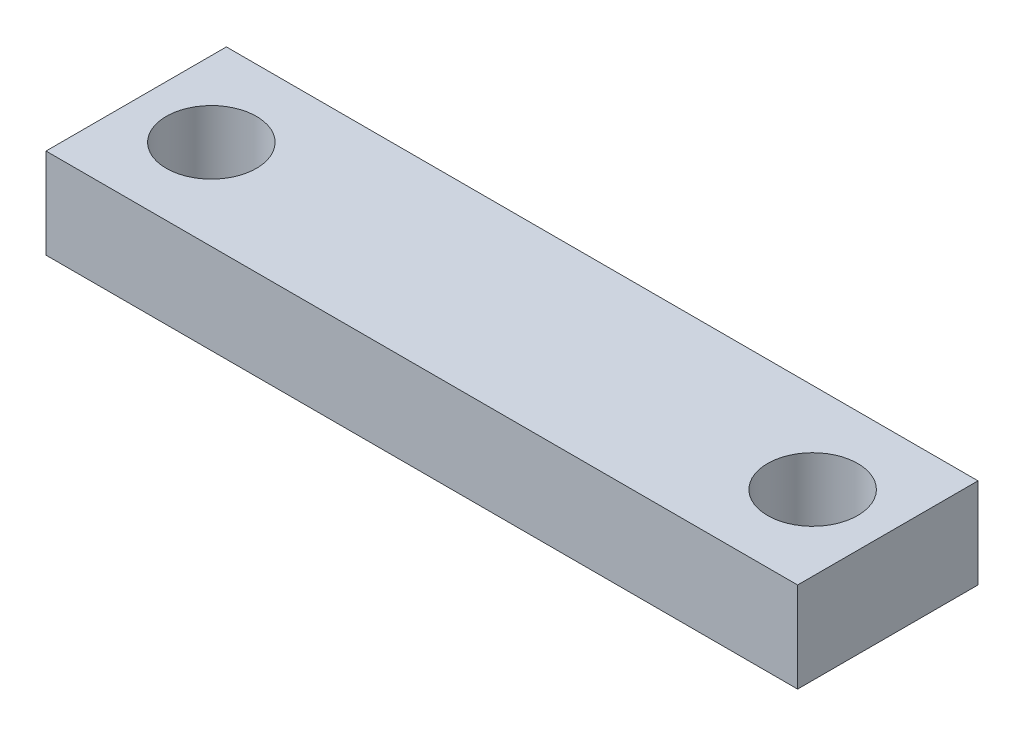
ISO-10303-21;
HEADER;
FILE_DESCRIPTION(('STEP AP214'),'2;1');
FILE_NAME('part.step','',(''),(''),'','','');
FILE_SCHEMA(('AUTOMOTIVE_DESIGN { 1 0 10303 214 1 1 1 1 }'));
ENDSEC;
DATA;
#1=APPLICATION_CONTEXT('core data for automotive mechanical design processes');
#2=APPLICATION_PROTOCOL_DEFINITION('international standard','automotive_design',2000,#1);
#3=PRODUCT_CONTEXT('',#1,'mechanical');
#4=PRODUCT('Part','Part','',(#3));
#5=PRODUCT_RELATED_PRODUCT_CATEGORY('part','',(#4));
#6=PRODUCT_DEFINITION_FORMATION('','',#4);
#7=PRODUCT_DEFINITION_CONTEXT('part definition',#1,'design');
#8=PRODUCT_DEFINITION('design','',#6,#7);
#9=PRODUCT_DEFINITION_SHAPE('','',#8);
#10=(LENGTH_UNIT() NAMED_UNIT(*) SI_UNIT(.MILLI.,.METRE.));
#11=(NAMED_UNIT(*) PLANE_ANGLE_UNIT() SI_UNIT($,.RADIAN.));
#12=(NAMED_UNIT(*) SI_UNIT($,.STERADIAN.) SOLID_ANGLE_UNIT());
#13=UNCERTAINTY_MEASURE_WITH_UNIT(LENGTH_MEASURE(1.E-05),#10,'distance_accuracy_value','');
#14=(GEOMETRIC_REPRESENTATION_CONTEXT(3) GLOBAL_UNCERTAINTY_ASSIGNED_CONTEXT((#13)) GLOBAL_UNIT_ASSIGNED_CONTEXT((#10,
#11,#12)) REPRESENTATION_CONTEXT('',''));
#15=CARTESIAN_POINT('',(0.,0.,0.));
#16=DIRECTION('',(0.,0.,1.));
#17=DIRECTION('',(1.,0.,0.));
#18=AXIS2_PLACEMENT_3D('',#15,#16,#17);
#19=CARTESIAN_POINT('',(0.,3.,0.));
#20=DIRECTION('',(1.,0.,0.));
#21=DIRECTION('',(0.,0.,-1.));
#22=AXIS2_PLACEMENT_3D('',#19,#20,#21);
#23=PLANE('',#22);
#24=DIRECTION('',(0.,0.,1.));
#25=VECTOR('',#24,1.);
#26=CARTESIAN_POINT('',(0.,0.,0.));
#27=LINE('',#26,#25);
#28=CARTESIAN_POINT('',(0.,0.,0.));
#29=VERTEX_POINT('',#28);
#30=CARTESIAN_POINT('',(0.,0.,6.));
#31=VERTEX_POINT('',#30);
#32=EDGE_CURVE('E107',#29,#31,#27,.T.);
#33=ORIENTED_EDGE('',*,*,#32,.T.);
#34=DIRECTION('',(0.,-1.,0.));
#35=VECTOR('',#34,1.);
#36=CARTESIAN_POINT('',(0.,3.,6.));
#37=LINE('',#36,#35);
#38=CARTESIAN_POINT('',(0.,3.,6.));
#39=VERTEX_POINT('',#38);
#40=EDGE_CURVE('E11',#39,#31,#37,.T.);
#41=ORIENTED_EDGE('',*,*,#40,.F.);
#42=DIRECTION('',(0.,0.,1.));
#43=VECTOR('',#42,1.);
#44=CARTESIAN_POINT('',(0.,3.,0.));
#45=LINE('',#44,#43);
#46=CARTESIAN_POINT('',(0.,3.,0.));
#47=VERTEX_POINT('',#46);
#48=EDGE_CURVE('E91',#47,#39,#45,.T.);
#49=ORIENTED_EDGE('',*,*,#48,.F.);
#50=DIRECTION('',(0.,-1.,0.));
#51=VECTOR('',#50,1.);
#52=CARTESIAN_POINT('',(0.,3.,0.));
#53=LINE('',#52,#51);
#54=EDGE_CURVE('E103',#47,#29,#53,.T.);
#55=ORIENTED_EDGE('',*,*,#54,.T.);
#56=EDGE_LOOP('',(#33,#41,#49,#55));
#57=FACE_BOUND('',#56,.T.);
#58=ADVANCED_FACE('F39',(#57),#23,.F.);
#59=CARTESIAN_POINT('',(0.,3.,6.));
#60=DIRECTION('',(0.,0.,-1.));
#61=DIRECTION('',(-1.,0.,0.));
#62=AXIS2_PLACEMENT_3D('',#59,#60,#61);
#63=PLANE('',#62);
#64=DIRECTION('',(1.,0.,0.));
#65=VECTOR('',#64,1.);
#66=CARTESIAN_POINT('',(0.,0.,6.));
#67=LINE('',#66,#65);
#68=CARTESIAN_POINT('',(25.,0.,6.));
#69=VERTEX_POINT('',#68);
#70=EDGE_CURVE('E96',#31,#69,#67,.T.);
#71=ORIENTED_EDGE('',*,*,#70,.T.);
#72=DIRECTION('',(0.,-1.,0.));
#73=VECTOR('',#72,1.);
#74=CARTESIAN_POINT('',(25.,3.,6.));
#75=LINE('',#74,#73);
#76=CARTESIAN_POINT('',(25.,3.,6.));
#77=VERTEX_POINT('',#76);
#78=EDGE_CURVE('E48',#77,#69,#75,.T.);
#79=ORIENTED_EDGE('',*,*,#78,.F.);
#80=DIRECTION('',(1.,0.,0.));
#81=VECTOR('',#80,1.);
#82=CARTESIAN_POINT('',(0.,3.,6.));
#83=LINE('',#82,#81);
#84=EDGE_CURVE('E86',#39,#77,#83,.T.);
#85=ORIENTED_EDGE('',*,*,#84,.F.);
#86=ORIENTED_EDGE('',*,*,#40,.T.);
#87=EDGE_LOOP('',(#71,#79,#85,#86));
#88=FACE_BOUND('',#87,.T.);
#89=ADVANCED_FACE('F95',(#88),#63,.F.);
#90=CARTESIAN_POINT('',(25.,3.,0.));
#91=DIRECTION('',(-1.,0.,0.));
#92=DIRECTION('',(0.,0.,1.));
#93=AXIS2_PLACEMENT_3D('',#90,#91,#92);
#94=PLANE('',#93);
#95=DIRECTION('',(0.,0.,-1.));
#96=VECTOR('',#95,1.);
#97=CARTESIAN_POINT('',(25.,0.,0.));
#98=LINE('',#97,#96);
#99=CARTESIAN_POINT('',(25.,0.,0.));
#100=VERTEX_POINT('',#99);
#101=EDGE_CURVE('E73',#69,#100,#98,.T.);
#102=ORIENTED_EDGE('',*,*,#101,.T.);
#103=DIRECTION('',(0.,-1.,0.));
#104=VECTOR('',#103,1.);
#105=CARTESIAN_POINT('',(25.,3.,0.));
#106=LINE('',#105,#104);
#107=CARTESIAN_POINT('',(25.,3.,0.));
#108=VERTEX_POINT('',#107);
#109=EDGE_CURVE('E98',#108,#100,#106,.T.);
#110=ORIENTED_EDGE('',*,*,#109,.F.);
#111=DIRECTION('',(0.,0.,-1.));
#112=VECTOR('',#111,1.);
#113=CARTESIAN_POINT('',(25.,3.,0.));
#114=LINE('',#113,#112);
#115=EDGE_CURVE('E89',#77,#108,#114,.T.);
#116=ORIENTED_EDGE('',*,*,#115,.F.);
#117=ORIENTED_EDGE('',*,*,#78,.T.);
#118=EDGE_LOOP('',(#102,#110,#116,#117));
#119=FACE_BOUND('',#118,.T.);
#120=ADVANCED_FACE('F99',(#119),#94,.F.);
#121=CARTESIAN_POINT('',(0.,3.,0.));
#122=DIRECTION('',(0.,0.,1.));
#123=DIRECTION('',(1.,0.,0.));
#124=AXIS2_PLACEMENT_3D('',#121,#122,#123);
#125=PLANE('',#124);
#126=DIRECTION('',(-1.,0.,0.));
#127=VECTOR('',#126,1.);
#128=CARTESIAN_POINT('',(0.,0.,0.));
#129=LINE('',#128,#127);
#130=EDGE_CURVE('E79',#100,#29,#129,.T.);
#131=ORIENTED_EDGE('',*,*,#130,.T.);
#132=ORIENTED_EDGE('',*,*,#54,.F.);
#133=DIRECTION('',(-1.,0.,0.));
#134=VECTOR('',#133,1.);
#135=CARTESIAN_POINT('',(0.,3.,0.));
#136=LINE('',#135,#134);
#137=EDGE_CURVE('E56',#108,#47,#136,.T.);
#138=ORIENTED_EDGE('',*,*,#137,.F.);
#139=ORIENTED_EDGE('',*,*,#109,.T.);
#140=EDGE_LOOP('',(#131,#132,#138,#139));
#141=FACE_BOUND('',#140,.T.);
#142=ADVANCED_FACE('F121',(#141),#125,.F.);
#143=CARTESIAN_POINT('',(0.,3.,0.));
#144=DIRECTION('',(0.,1.,0.));
#145=DIRECTION('',(0.,0.,1.));
#146=AXIS2_PLACEMENT_3D('',#143,#144,#145);
#147=PLANE('',#146);
#148=CARTESIAN_POINT('',(2.5,3.,3.));
#149=DIRECTION('',(0.,1.,0.));
#150=DIRECTION('',(0.,0.,1.));
#151=AXIS2_PLACEMENT_3D('',#148,#149,#150);
#152=CIRCLE('',#151,1.5);
#153=CARTESIAN_POINT('',(2.5,3.,4.5));
#154=VERTEX_POINT('',#153);
#155=EDGE_CURVE('E136',#154,#154,#152,.T.);
#156=ORIENTED_EDGE('',*,*,#155,.F.);
#157=EDGE_LOOP('',(#156));
#158=FACE_BOUND('',#157,.T.);
#159=CARTESIAN_POINT('',(22.5,3.,3.));
#160=DIRECTION('',(0.,1.,0.));
#161=DIRECTION('',(0.,0.,1.));
#162=AXIS2_PLACEMENT_3D('',#159,#160,#161);
#163=CIRCLE('',#162,1.5);
#164=CARTESIAN_POINT('',(22.5,3.,4.5));
#165=VERTEX_POINT('',#164);
#166=EDGE_CURVE('E128',#165,#165,#163,.T.);
#167=ORIENTED_EDGE('',*,*,#166,.F.);
#168=EDGE_LOOP('',(#167));
#169=FACE_BOUND('',#168,.T.);
#170=ORIENTED_EDGE('',*,*,#48,.T.);
#171=ORIENTED_EDGE('',*,*,#84,.T.);
#172=ORIENTED_EDGE('',*,*,#115,.T.);
#173=ORIENTED_EDGE('',*,*,#137,.T.);
#174=EDGE_LOOP('',(#170,#171,#172,#173));
#175=FACE_BOUND('',#174,.T.);
#176=ADVANCED_FACE('F87',(#158,#169,#175),#147,.T.);
#177=CARTESIAN_POINT('',(0.,0.,0.));
#178=DIRECTION('',(0.,1.,0.));
#179=DIRECTION('',(0.,0.,1.));
#180=AXIS2_PLACEMENT_3D('',#177,#178,#179);
#181=PLANE('',#180);
#182=CARTESIAN_POINT('',(2.5,0.,3.));
#183=DIRECTION('',(0.,1.,0.));
#184=DIRECTION('',(0.,0.,1.));
#185=AXIS2_PLACEMENT_3D('',#182,#183,#184);
#186=CIRCLE('',#185,1.5);
#187=CARTESIAN_POINT('',(2.5,0.,4.5));
#188=VERTEX_POINT('',#187);
#189=EDGE_CURVE('E111',#188,#188,#186,.T.);
#190=ORIENTED_EDGE('',*,*,#189,.T.);
#191=EDGE_LOOP('',(#190));
#192=FACE_BOUND('',#191,.T.);
#193=CARTESIAN_POINT('',(22.5,0.,3.));
#194=DIRECTION('',(0.,1.,0.));
#195=DIRECTION('',(0.,0.,1.));
#196=AXIS2_PLACEMENT_3D('',#193,#194,#195);
#197=CIRCLE('',#196,1.5);
#198=CARTESIAN_POINT('',(22.5,0.,4.5));
#199=VERTEX_POINT('',#198);
#200=EDGE_CURVE('E132',#199,#199,#197,.T.);
#201=ORIENTED_EDGE('',*,*,#200,.T.);
#202=EDGE_LOOP('',(#201));
#203=FACE_BOUND('',#202,.T.);
#204=ORIENTED_EDGE('',*,*,#32,.F.);
#205=ORIENTED_EDGE('',*,*,#130,.F.);
#206=ORIENTED_EDGE('',*,*,#101,.F.);
#207=ORIENTED_EDGE('',*,*,#70,.F.);
#208=EDGE_LOOP('',(#204,#205,#206,#207));
#209=FACE_BOUND('',#208,.T.);
#210=ADVANCED_FACE('F124',(#192,#203,#209),#181,.F.);
#211=CARTESIAN_POINT('',(22.5,0.,3.));
#212=DIRECTION('',(0.,1.,0.));
#213=DIRECTION('',(0.,0.,1.));
#214=AXIS2_PLACEMENT_3D('',#211,#212,#213);
#215=CYLINDRICAL_SURFACE('',#214,1.5);
#216=ORIENTED_EDGE('',*,*,#200,.F.);
#217=EDGE_LOOP('',(#216));
#218=FACE_BOUND('',#217,.T.);
#219=ORIENTED_EDGE('',*,*,#166,.T.);
#220=EDGE_LOOP('',(#219));
#221=FACE_BOUND('',#220,.T.);
#222=ADVANCED_FACE('F149',(#218,#221),#215,.F.);
#223=CARTESIAN_POINT('',(2.5,0.,3.));
#224=DIRECTION('',(0.,1.,0.));
#225=DIRECTION('',(0.,0.,1.));
#226=AXIS2_PLACEMENT_3D('',#223,#224,#225);
#227=CYLINDRICAL_SURFACE('',#226,1.5);
#228=ORIENTED_EDGE('',*,*,#189,.F.);
#229=EDGE_LOOP('',(#228));
#230=FACE_BOUND('',#229,.T.);
#231=ORIENTED_EDGE('',*,*,#155,.T.);
#232=EDGE_LOOP('',(#231));
#233=FACE_BOUND('',#232,.T.);
#234=ADVANCED_FACE('F146',(#230,#233),#227,.F.);
#235=CLOSED_SHELL('',(#58,#89,#120,#142,#176,#210,#222,#234));
#236=MANIFOLD_SOLID_BREP('B2',#235);
#237=ADVANCED_BREP_SHAPE_REPRESENTATION('',(#18,#236),#14);
#238=SHAPE_DEFINITION_REPRESENTATION(#9,#237);
ENDSEC;
END-ISO-10303-21;
